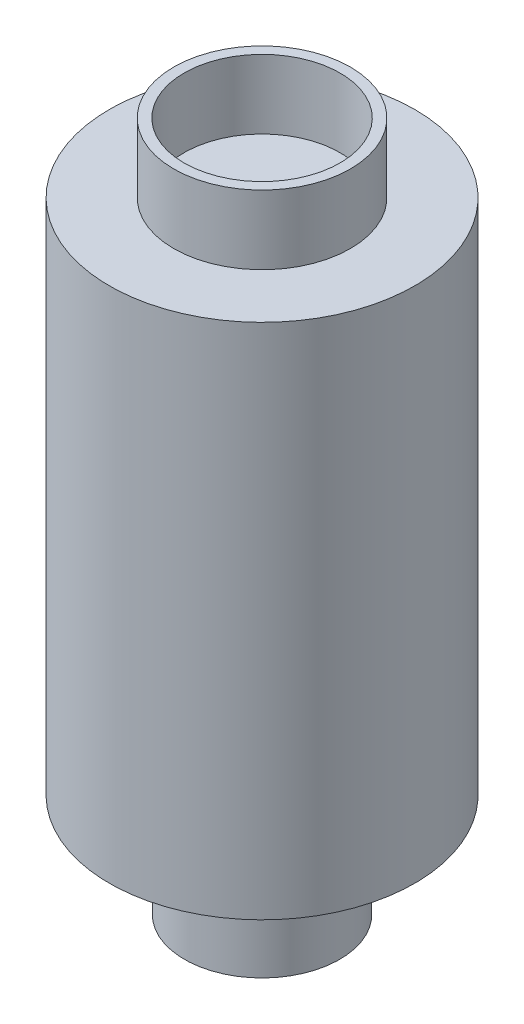
ISO-10303-21;
HEADER;
FILE_DESCRIPTION(('STEP AP214'),'2;1');
FILE_NAME('part.step','',(''),(''),'','','');
FILE_SCHEMA(('AUTOMOTIVE_DESIGN { 1 0 10303 214 1 1 1 1 }'));
ENDSEC;
DATA;
#1=APPLICATION_CONTEXT('core data for automotive mechanical design processes');
#2=APPLICATION_PROTOCOL_DEFINITION('international standard','automotive_design',2000,#1);
#3=PRODUCT_CONTEXT('',#1,'mechanical');
#4=PRODUCT('Part','Part','',(#3));
#5=PRODUCT_RELATED_PRODUCT_CATEGORY('part','',(#4));
#6=PRODUCT_DEFINITION_FORMATION('','',#4);
#7=PRODUCT_DEFINITION_CONTEXT('part definition',#1,'design');
#8=PRODUCT_DEFINITION('design','',#6,#7);
#9=PRODUCT_DEFINITION_SHAPE('','',#8);
#10=(LENGTH_UNIT() NAMED_UNIT(*) SI_UNIT(.MILLI.,.METRE.));
#11=(NAMED_UNIT(*) PLANE_ANGLE_UNIT() SI_UNIT($,.RADIAN.));
#12=(NAMED_UNIT(*) SI_UNIT($,.STERADIAN.) SOLID_ANGLE_UNIT());
#13=UNCERTAINTY_MEASURE_WITH_UNIT(LENGTH_MEASURE(1.E-05),#10,'distance_accuracy_value','');
#14=(GEOMETRIC_REPRESENTATION_CONTEXT(3) GLOBAL_UNCERTAINTY_ASSIGNED_CONTEXT((#13)) GLOBAL_UNIT_ASSIGNED_CONTEXT((#10,
#11,#12)) REPRESENTATION_CONTEXT('',''));
#15=CARTESIAN_POINT('',(0.,0.,0.));
#16=DIRECTION('',(0.,0.,1.));
#17=DIRECTION('',(1.,0.,0.));
#18=AXIS2_PLACEMENT_3D('',#15,#16,#17);
#19=CARTESIAN_POINT('',(0.,10.,0.));
#20=DIRECTION('',(0.,1.,0.));
#21=DIRECTION('',(0.,0.,1.));
#22=AXIS2_PLACEMENT_3D('',#19,#20,#21);
#23=PLANE('',#22);
#24=CARTESIAN_POINT('',(0.,10.,0.));
#25=DIRECTION('',(0.,1.,0.));
#26=DIRECTION('',(0.,0.,1.));
#27=AXIS2_PLACEMENT_3D('',#24,#25,#26);
#28=CIRCLE('',#27,12.8);
#29=CARTESIAN_POINT('',(0.,10.,12.8));
#30=VERTEX_POINT('',#29);
#31=EDGE_CURVE('E45',#30,#30,#28,.T.);
#32=ORIENTED_EDGE('',*,*,#31,.T.);
#33=EDGE_LOOP('',(#32));
#34=FACE_BOUND('',#33,.T.);
#35=CARTESIAN_POINT('',(0.,10.,0.));
#36=DIRECTION('',(0.,1.,0.));
#37=DIRECTION('',(0.,0.,1.));
#38=AXIS2_PLACEMENT_3D('',#35,#36,#37);
#39=CIRCLE('',#38,11.3);
#40=CARTESIAN_POINT('',(0.,10.,11.3));
#41=VERTEX_POINT('',#40);
#42=EDGE_CURVE('E50',#41,#41,#39,.T.);
#43=ORIENTED_EDGE('',*,*,#42,.F.);
#44=EDGE_LOOP('',(#43));
#45=FACE_BOUND('',#44,.T.);
#46=ADVANCED_FACE('F37',(#34,#45),#23,.T.);
#47=CARTESIAN_POINT('',(0.,10.,0.));
#48=DIRECTION('',(0.,-1.,0.));
#49=DIRECTION('',(0.,0.,-1.));
#50=AXIS2_PLACEMENT_3D('',#47,#48,#49);
#51=CYLINDRICAL_SURFACE('',#50,12.8);
#52=ORIENTED_EDGE('',*,*,#31,.F.);
#53=EDGE_LOOP('',(#52));
#54=FACE_BOUND('',#53,.T.);
#55=CARTESIAN_POINT('',(0.,0.,0.));
#56=DIRECTION('',(0.,1.,0.));
#57=DIRECTION('',(0.,0.,1.));
#58=AXIS2_PLACEMENT_3D('',#55,#56,#57);
#59=CIRCLE('',#58,12.8);
#60=CARTESIAN_POINT('',(0.,0.,12.8));
#61=VERTEX_POINT('',#60);
#62=EDGE_CURVE('E59',#61,#61,#59,.T.);
#63=ORIENTED_EDGE('',*,*,#62,.T.);
#64=EDGE_LOOP('',(#63));
#65=FACE_BOUND('',#64,.T.);
#66=ADVANCED_FACE('F39',(#54,#65),#51,.T.);
#67=CARTESIAN_POINT('',(0.,10.,0.));
#68=DIRECTION('',(0.,-1.,0.));
#69=DIRECTION('',(0.,0.,-1.));
#70=AXIS2_PLACEMENT_3D('',#67,#68,#69);
#71=CYLINDRICAL_SURFACE('',#70,11.3);
#72=ORIENTED_EDGE('',*,*,#42,.T.);
#73=EDGE_LOOP('',(#72));
#74=FACE_BOUND('',#73,.T.);
#75=CARTESIAN_POINT('',(0.,0.,0.));
#76=DIRECTION('',(0.,1.,0.));
#77=DIRECTION('',(0.,0.,1.));
#78=AXIS2_PLACEMENT_3D('',#75,#76,#77);
#79=CIRCLE('',#78,11.3);
#80=CARTESIAN_POINT('',(0.,0.,11.3));
#81=VERTEX_POINT('',#80);
#82=EDGE_CURVE('E56',#81,#81,#79,.T.);
#83=ORIENTED_EDGE('',*,*,#82,.F.);
#84=EDGE_LOOP('',(#83));
#85=FACE_BOUND('',#84,.T.);
#86=ADVANCED_FACE('F113',(#74,#85),#71,.F.);
#87=CARTESIAN_POINT('',(0.,0.,0.));
#88=DIRECTION('',(0.,-1.,0.));
#89=DIRECTION('',(0.,0.,-1.));
#90=AXIS2_PLACEMENT_3D('',#87,#88,#89);
#91=PLANE('',#90);
#92=ORIENTED_EDGE('',*,*,#82,.T.);
#93=EDGE_LOOP('',(#92));
#94=FACE_BOUND('',#93,.T.);
#95=ADVANCED_FACE('F107',(#94),#91,.F.);
#96=CARTESIAN_POINT('',(0.,-75.,0.));
#97=DIRECTION('',(0.,1.,0.));
#98=DIRECTION('',(0.,0.,1.));
#99=AXIS2_PLACEMENT_3D('',#96,#97,#98);
#100=CYLINDRICAL_SURFACE('',#99,22.1390804924497);
#101=CARTESIAN_POINT('',(0.,-75.,0.));
#102=DIRECTION('',(0.,-1.,0.));
#103=DIRECTION('',(0.,0.,-1.));
#104=AXIS2_PLACEMENT_3D('',#101,#102,#103);
#105=CIRCLE('',#104,22.1390804924497);
#106=CARTESIAN_POINT('',(0.,-75.,-22.1390804924497));
#107=VERTEX_POINT('',#106);
#108=EDGE_CURVE('E62',#107,#107,#105,.T.);
#109=ORIENTED_EDGE('',*,*,#108,.F.);
#110=EDGE_LOOP('',(#109));
#111=FACE_BOUND('',#110,.T.);
#112=CARTESIAN_POINT('',(0.,0.,0.));
#113=DIRECTION('',(0.,-1.,0.));
#114=DIRECTION('',(0.,0.,-1.));
#115=AXIS2_PLACEMENT_3D('',#112,#113,#114);
#116=CIRCLE('',#115,22.1390804924497);
#117=CARTESIAN_POINT('',(0.,0.,-22.1390804924497));
#118=VERTEX_POINT('',#117);
#119=EDGE_CURVE('E69',#118,#118,#116,.T.);
#120=ORIENTED_EDGE('',*,*,#119,.T.);
#121=EDGE_LOOP('',(#120));
#122=FACE_BOUND('',#121,.T.);
#123=ADVANCED_FACE('F120',(#111,#122),#100,.T.);
#124=CARTESIAN_POINT('',(0.,-75.,0.));
#125=DIRECTION('',(0.,-1.,0.));
#126=DIRECTION('',(0.,0.,-1.));
#127=AXIS2_PLACEMENT_3D('',#124,#125,#126);
#128=PLANE('',#127);
#129=CARTESIAN_POINT('',(0.,-75.,0.));
#130=DIRECTION('',(0.,-1.,0.));
#131=DIRECTION('',(0.,0.,-1.));
#132=AXIS2_PLACEMENT_3D('',#129,#130,#131);
#133=CIRCLE('',#132,11.25);
#134=CARTESIAN_POINT('',(0.,-75.,-11.25));
#135=VERTEX_POINT('',#134);
#136=EDGE_CURVE('E78',#135,#135,#133,.T.);
#137=ORIENTED_EDGE('',*,*,#136,.F.);
#138=EDGE_LOOP('',(#137));
#139=FACE_BOUND('',#138,.T.);
#140=ORIENTED_EDGE('',*,*,#108,.T.);
#141=EDGE_LOOP('',(#140));
#142=FACE_BOUND('',#141,.T.);
#143=ADVANCED_FACE('F104',(#139,#142),#128,.T.);
#144=ORIENTED_EDGE('',*,*,#62,.F.);
#145=EDGE_LOOP('',(#144));
#146=FACE_BOUND('',#145,.T.);
#147=ORIENTED_EDGE('',*,*,#119,.F.);
#148=EDGE_LOOP('',(#147));
#149=FACE_BOUND('',#148,.T.);
#150=ADVANCED_FACE('F95',(#146,#149),#91,.F.);
#151=CARTESIAN_POINT('',(0.,-90.,0.));
#152=DIRECTION('',(0.,-1.,0.));
#153=DIRECTION('',(0.,0.,-1.));
#154=AXIS2_PLACEMENT_3D('',#151,#152,#153);
#155=PLANE('',#154);
#156=CARTESIAN_POINT('',(0.,-90.,0.));
#157=DIRECTION('',(0.,-1.,0.));
#158=DIRECTION('',(0.,0.,-1.));
#159=AXIS2_PLACEMENT_3D('',#156,#157,#158);
#160=CIRCLE('',#159,11.25);
#161=CARTESIAN_POINT('',(0.,-90.,-11.25));
#162=VERTEX_POINT('',#161);
#163=EDGE_CURVE('E75',#162,#162,#160,.T.);
#164=ORIENTED_EDGE('',*,*,#163,.T.);
#165=EDGE_LOOP('',(#164));
#166=FACE_BOUND('',#165,.T.);
#167=CARTESIAN_POINT('',(0.,-90.,0.));
#168=DIRECTION('',(0.,-1.,0.));
#169=DIRECTION('',(0.,0.,-1.));
#170=AXIS2_PLACEMENT_3D('',#167,#168,#169);
#171=CIRCLE('',#170,8.25);
#172=CARTESIAN_POINT('',(0.,-90.,-8.25));
#173=VERTEX_POINT('',#172);
#174=EDGE_CURVE('E82',#173,#173,#171,.T.);
#175=ORIENTED_EDGE('',*,*,#174,.F.);
#176=EDGE_LOOP('',(#175));
#177=FACE_BOUND('',#176,.T.);
#178=ADVANCED_FACE('F92',(#166,#177),#155,.T.);
#179=CARTESIAN_POINT('',(0.,-90.,0.));
#180=DIRECTION('',(0.,1.,0.));
#181=DIRECTION('',(0.,0.,1.));
#182=AXIS2_PLACEMENT_3D('',#179,#180,#181);
#183=CYLINDRICAL_SURFACE('',#182,11.25);
#184=ORIENTED_EDGE('',*,*,#163,.F.);
#185=EDGE_LOOP('',(#184));
#186=FACE_BOUND('',#185,.T.);
#187=ORIENTED_EDGE('',*,*,#136,.T.);
#188=EDGE_LOOP('',(#187));
#189=FACE_BOUND('',#188,.T.);
#190=ADVANCED_FACE('F94',(#186,#189),#183,.T.);
#191=CARTESIAN_POINT('',(0.,-90.,0.));
#192=DIRECTION('',(0.,1.,0.));
#193=DIRECTION('',(0.,0.,1.));
#194=AXIS2_PLACEMENT_3D('',#191,#192,#193);
#195=CYLINDRICAL_SURFACE('',#194,8.25);
#196=ORIENTED_EDGE('',*,*,#174,.T.);
#197=EDGE_LOOP('',(#196));
#198=FACE_BOUND('',#197,.T.);
#199=CARTESIAN_POINT('',(0.,-75.,0.));
#200=DIRECTION('',(0.,-1.,0.));
#201=DIRECTION('',(0.,0.,-1.));
#202=AXIS2_PLACEMENT_3D('',#199,#200,#201);
#203=CIRCLE('',#202,8.25);
#204=CARTESIAN_POINT('',(0.,-75.,-8.25));
#205=VERTEX_POINT('',#204);
#206=EDGE_CURVE('E10',#205,#205,#203,.F.);
#207=ORIENTED_EDGE('',*,*,#206,.T.);
#208=EDGE_LOOP('',(#207));
#209=FACE_BOUND('',#208,.T.);
#210=ADVANCED_FACE('F90',(#198,#209),#195,.F.);
#211=ORIENTED_EDGE('',*,*,#206,.F.);
#212=EDGE_LOOP('',(#211));
#213=FACE_BOUND('',#212,.T.);
#214=ADVANCED_FACE('F126',(#213),#128,.T.);
#215=CLOSED_SHELL('',(#46,#66,#86,#95,#123,#143,#150,#178,#190,#210,#214));
#216=MANIFOLD_SOLID_BREP('B2',#215);
#217=ADVANCED_BREP_SHAPE_REPRESENTATION('',(#18,#216),#14);
#218=SHAPE_DEFINITION_REPRESENTATION(#9,#217);
ENDSEC;
END-ISO-10303-21;
